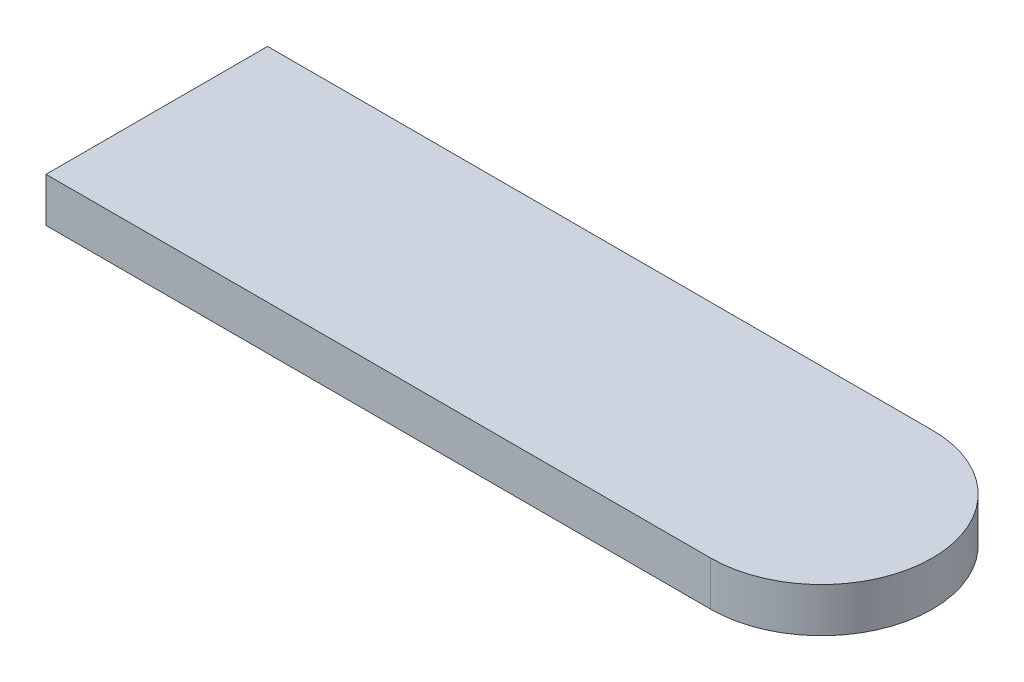
ISO-10303-21;
HEADER;
FILE_DESCRIPTION(('STEP AP214'),'2;1');
FILE_NAME('part.step','',(''),(''),'','','');
FILE_SCHEMA(('AUTOMOTIVE_DESIGN { 1 0 10303 214 1 1 1 1 }'));
ENDSEC;
DATA;
#1=APPLICATION_CONTEXT('core data for automotive mechanical design processes');
#2=APPLICATION_PROTOCOL_DEFINITION('international standard','automotive_design',2000,#1);
#3=PRODUCT_CONTEXT('',#1,'mechanical');
#4=PRODUCT('Part','Part','',(#3));
#5=PRODUCT_RELATED_PRODUCT_CATEGORY('part','',(#4));
#6=PRODUCT_DEFINITION_FORMATION('','',#4);
#7=PRODUCT_DEFINITION_CONTEXT('part definition',#1,'design');
#8=PRODUCT_DEFINITION('design','',#6,#7);
#9=PRODUCT_DEFINITION_SHAPE('','',#8);
#10=(LENGTH_UNIT() NAMED_UNIT(*) SI_UNIT(.MILLI.,.METRE.));
#11=(NAMED_UNIT(*) PLANE_ANGLE_UNIT() SI_UNIT($,.RADIAN.));
#12=(NAMED_UNIT(*) SI_UNIT($,.STERADIAN.) SOLID_ANGLE_UNIT());
#13=UNCERTAINTY_MEASURE_WITH_UNIT(LENGTH_MEASURE(1.E-05),#10,'distance_accuracy_value','');
#14=(GEOMETRIC_REPRESENTATION_CONTEXT(3) GLOBAL_UNCERTAINTY_ASSIGNED_CONTEXT((#13)) GLOBAL_UNIT_ASSIGNED_CONTEXT((#10,
#11,#12)) REPRESENTATION_CONTEXT('',''));
#15=CARTESIAN_POINT('',(0.,0.,0.));
#16=DIRECTION('',(0.,0.,1.));
#17=DIRECTION('',(1.,0.,0.));
#18=AXIS2_PLACEMENT_3D('',#15,#16,#17);
#19=CARTESIAN_POINT('',(-87.5,10.,25.));
#20=DIRECTION('',(0.,0.,-1.));
#21=DIRECTION('',(-1.,0.,0.));
#22=AXIS2_PLACEMENT_3D('',#19,#20,#21);
#23=PLANE('',#22);
#24=DIRECTION('',(1.,0.,0.));
#25=VECTOR('',#24,1.);
#26=CARTESIAN_POINT('',(-87.5,0.,25.));
#27=LINE('',#26,#25);
#28=CARTESIAN_POINT('',(-87.5,0.,25.));
#29=VERTEX_POINT('',#28);
#30=CARTESIAN_POINT('',(62.5,0.,25.));
#31=VERTEX_POINT('',#30);
#32=EDGE_CURVE('E96',#29,#31,#27,.T.);
#33=ORIENTED_EDGE('',*,*,#32,.T.);
#34=DIRECTION('',(0.,-1.,0.));
#35=VECTOR('',#34,1.);
#36=CARTESIAN_POINT('',(62.5,10.,25.));
#37=LINE('',#36,#35);
#38=CARTESIAN_POINT('',(62.5,10.,25.));
#39=VERTEX_POINT('',#38);
#40=EDGE_CURVE('E11',#39,#31,#37,.T.);
#41=ORIENTED_EDGE('',*,*,#40,.F.);
#42=DIRECTION('',(1.,0.,0.));
#43=VECTOR('',#42,1.);
#44=CARTESIAN_POINT('',(-87.5,10.,25.));
#45=LINE('',#44,#43);
#46=CARTESIAN_POINT('',(-87.5,10.,25.));
#47=VERTEX_POINT('',#46);
#48=EDGE_CURVE('E84',#47,#39,#45,.T.);
#49=ORIENTED_EDGE('',*,*,#48,.F.);
#50=DIRECTION('',(0.,-1.,0.));
#51=VECTOR('',#50,1.);
#52=CARTESIAN_POINT('',(-87.5,10.,25.));
#53=LINE('',#52,#51);
#54=EDGE_CURVE('E92',#47,#29,#53,.T.);
#55=ORIENTED_EDGE('',*,*,#54,.T.);
#56=EDGE_LOOP('',(#33,#41,#49,#55));
#57=FACE_BOUND('',#56,.T.);
#58=ADVANCED_FACE('F33',(#57),#23,.F.);
#59=CARTESIAN_POINT('',(62.5,10.,0.));
#60=DIRECTION('',(0.,-1.,0.));
#61=DIRECTION('',(0.,0.,-1.));
#62=AXIS2_PLACEMENT_3D('',#59,#60,#61);
#63=CYLINDRICAL_SURFACE('',#62,25.);
#64=CARTESIAN_POINT('',(62.5,0.,0.));
#65=DIRECTION('',(0.,1.,0.));
#66=DIRECTION('',(0.,0.,-1.));
#67=AXIS2_PLACEMENT_3D('',#64,#65,#66);
#68=CIRCLE('',#67,25.);
#69=CARTESIAN_POINT('',(62.5,0.,-25.));
#70=VERTEX_POINT('',#69);
#71=EDGE_CURVE('E88',#31,#70,#68,.T.);
#72=ORIENTED_EDGE('',*,*,#71,.T.);
#73=DIRECTION('',(0.,-1.,0.));
#74=VECTOR('',#73,1.);
#75=CARTESIAN_POINT('',(62.5,10.,-25.));
#76=LINE('',#75,#74);
#77=CARTESIAN_POINT('',(62.5,10.,-25.));
#78=VERTEX_POINT('',#77);
#79=EDGE_CURVE('E41',#78,#70,#76,.T.);
#80=ORIENTED_EDGE('',*,*,#79,.F.);
#81=CARTESIAN_POINT('',(62.5,10.,0.));
#82=DIRECTION('',(0.,1.,0.));
#83=DIRECTION('',(0.,0.,-1.));
#84=AXIS2_PLACEMENT_3D('',#81,#82,#83);
#85=CIRCLE('',#84,25.);
#86=EDGE_CURVE('E79',#39,#78,#85,.T.);
#87=ORIENTED_EDGE('',*,*,#86,.F.);
#88=ORIENTED_EDGE('',*,*,#40,.T.);
#89=EDGE_LOOP('',(#72,#80,#87,#88));
#90=FACE_BOUND('',#89,.T.);
#91=ADVANCED_FACE('F87',(#90),#63,.T.);
#92=CARTESIAN_POINT('',(-87.5,10.,-25.));
#93=DIRECTION('',(0.,0.,1.));
#94=DIRECTION('',(1.,0.,0.));
#95=AXIS2_PLACEMENT_3D('',#92,#93,#94);
#96=PLANE('',#95);
#97=DIRECTION('',(-1.,0.,0.));
#98=VECTOR('',#97,1.);
#99=CARTESIAN_POINT('',(-87.5,0.,-25.));
#100=LINE('',#99,#98);
#101=CARTESIAN_POINT('',(-87.5,0.,-25.));
#102=VERTEX_POINT('',#101);
#103=EDGE_CURVE('E66',#70,#102,#100,.T.);
#104=ORIENTED_EDGE('',*,*,#103,.T.);
#105=DIRECTION('',(0.,-1.,0.));
#106=VECTOR('',#105,1.);
#107=CARTESIAN_POINT('',(-87.5,10.,-25.));
#108=LINE('',#107,#106);
#109=CARTESIAN_POINT('',(-87.5,10.,-25.));
#110=VERTEX_POINT('',#109);
#111=EDGE_CURVE('E89',#110,#102,#108,.T.);
#112=ORIENTED_EDGE('',*,*,#111,.F.);
#113=DIRECTION('',(-1.,0.,0.));
#114=VECTOR('',#113,1.);
#115=CARTESIAN_POINT('',(-87.5,10.,-25.));
#116=LINE('',#115,#114);
#117=EDGE_CURVE('E82',#78,#110,#116,.T.);
#118=ORIENTED_EDGE('',*,*,#117,.F.);
#119=ORIENTED_EDGE('',*,*,#79,.T.);
#120=EDGE_LOOP('',(#104,#112,#118,#119));
#121=FACE_BOUND('',#120,.T.);
#122=ADVANCED_FACE('F90',(#121),#96,.F.);
#123=CARTESIAN_POINT('',(-87.5,10.,-25.));
#124=DIRECTION('',(1.,0.,0.));
#125=DIRECTION('',(0.,0.,-1.));
#126=AXIS2_PLACEMENT_3D('',#123,#124,#125);
#127=PLANE('',#126);
#128=DIRECTION('',(0.,0.,1.));
#129=VECTOR('',#128,1.);
#130=CARTESIAN_POINT('',(-87.5,0.,-25.));
#131=LINE('',#130,#129);
#132=EDGE_CURVE('E72',#102,#29,#131,.T.);
#133=ORIENTED_EDGE('',*,*,#132,.T.);
#134=ORIENTED_EDGE('',*,*,#54,.F.);
#135=DIRECTION('',(0.,0.,1.));
#136=VECTOR('',#135,1.);
#137=CARTESIAN_POINT('',(-87.5,10.,-25.));
#138=LINE('',#137,#136);
#139=EDGE_CURVE('E49',#110,#47,#138,.T.);
#140=ORIENTED_EDGE('',*,*,#139,.F.);
#141=ORIENTED_EDGE('',*,*,#111,.T.);
#142=EDGE_LOOP('',(#133,#134,#140,#141));
#143=FACE_BOUND('',#142,.T.);
#144=ADVANCED_FACE('F103',(#143),#127,.F.);
#145=CARTESIAN_POINT('',(62.5,10.,0.));
#146=DIRECTION('',(0.,-1.,0.));
#147=DIRECTION('',(0.,0.,-1.));
#148=AXIS2_PLACEMENT_3D('',#145,#146,#147);
#149=PLANE('',#148);
#150=ORIENTED_EDGE('',*,*,#48,.T.);
#151=ORIENTED_EDGE('',*,*,#86,.T.);
#152=ORIENTED_EDGE('',*,*,#117,.T.);
#153=ORIENTED_EDGE('',*,*,#139,.T.);
#154=EDGE_LOOP('',(#150,#151,#152,#153));
#155=FACE_BOUND('',#154,.T.);
#156=ADVANCED_FACE('F80',(#155),#149,.F.);
#157=CARTESIAN_POINT('',(62.5,0.,0.));
#158=DIRECTION('',(0.,-1.,0.));
#159=DIRECTION('',(0.,0.,-1.));
#160=AXIS2_PLACEMENT_3D('',#157,#158,#159);
#161=PLANE('',#160);
#162=ORIENTED_EDGE('',*,*,#32,.F.);
#163=ORIENTED_EDGE('',*,*,#132,.F.);
#164=ORIENTED_EDGE('',*,*,#103,.F.);
#165=ORIENTED_EDGE('',*,*,#71,.F.);
#166=EDGE_LOOP('',(#162,#163,#164,#165));
#167=FACE_BOUND('',#166,.T.);
#168=ADVANCED_FACE('F106',(#167),#161,.T.);
#169=CLOSED_SHELL('',(#58,#91,#122,#144,#156,#168));
#170=MANIFOLD_SOLID_BREP('B2',#169);
#171=ADVANCED_BREP_SHAPE_REPRESENTATION('',(#18,#170),#14);
#172=SHAPE_DEFINITION_REPRESENTATION(#9,#171);
ENDSEC;
END-ISO-10303-21;
